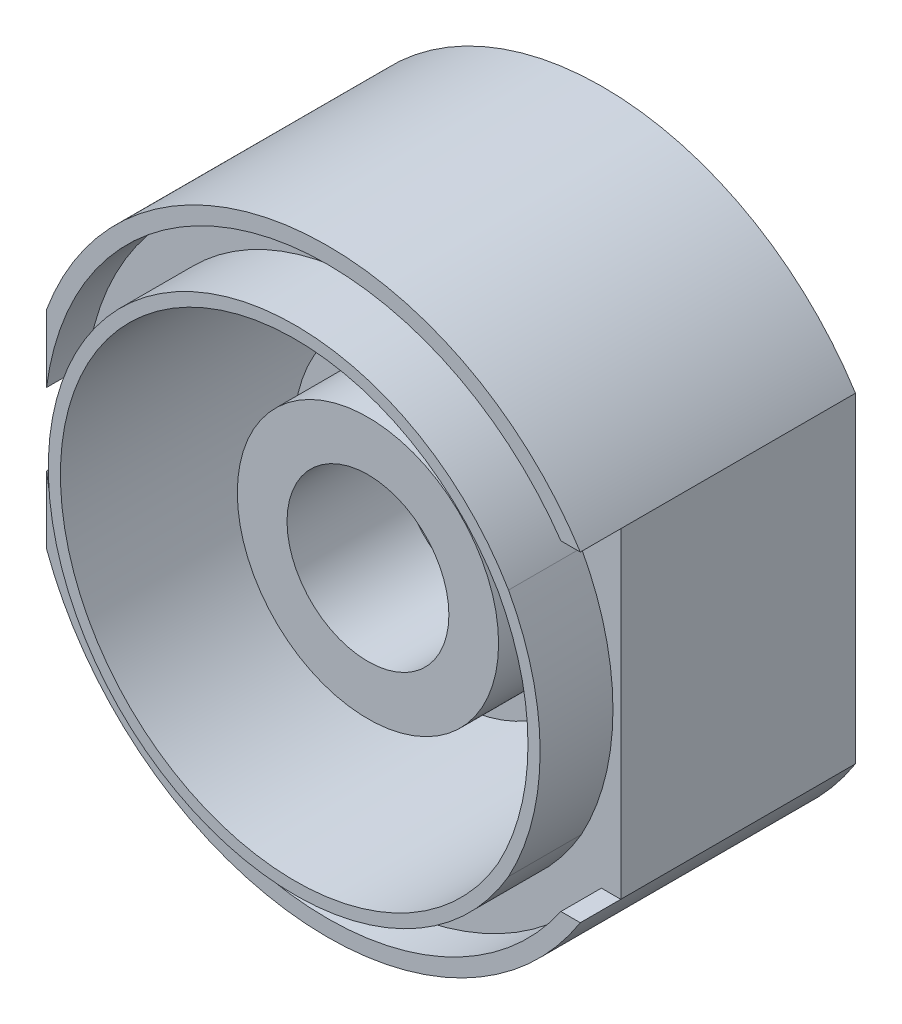
ISO-10303-21;
HEADER;
FILE_DESCRIPTION(('STEP AP214'),'2;1');
FILE_NAME('part.step','',(''),(''),'','','');
FILE_SCHEMA(('AUTOMOTIVE_DESIGN { 1 0 10303 214 1 1 1 1 }'));
ENDSEC;
DATA;
#1=APPLICATION_CONTEXT('core data for automotive mechanical design processes');
#2=APPLICATION_PROTOCOL_DEFINITION('international standard','automotive_design',2000,#1);
#3=PRODUCT_CONTEXT('',#1,'mechanical');
#4=PRODUCT('Part','Part','',(#3));
#5=PRODUCT_RELATED_PRODUCT_CATEGORY('part','',(#4));
#6=PRODUCT_DEFINITION_FORMATION('','',#4);
#7=PRODUCT_DEFINITION_CONTEXT('part definition',#1,'design');
#8=PRODUCT_DEFINITION('design','',#6,#7);
#9=PRODUCT_DEFINITION_SHAPE('','',#8);
#10=(LENGTH_UNIT() NAMED_UNIT(*) SI_UNIT(.MILLI.,.METRE.));
#11=(NAMED_UNIT(*) PLANE_ANGLE_UNIT() SI_UNIT($,.RADIAN.));
#12=(NAMED_UNIT(*) SI_UNIT($,.STERADIAN.) SOLID_ANGLE_UNIT());
#13=UNCERTAINTY_MEASURE_WITH_UNIT(LENGTH_MEASURE(1.E-05),#10,'distance_accuracy_value','');
#14=(GEOMETRIC_REPRESENTATION_CONTEXT(3) GLOBAL_UNCERTAINTY_ASSIGNED_CONTEXT((#13)) GLOBAL_UNIT_ASSIGNED_CONTEXT((#10,
#11,#12)) REPRESENTATION_CONTEXT('',''));
#15=CARTESIAN_POINT('',(0.,0.,0.));
#16=DIRECTION('',(0.,0.,1.));
#17=DIRECTION('',(1.,0.,0.));
#18=AXIS2_PLACEMENT_3D('',#15,#16,#17);
#19=CARTESIAN_POINT('',(2.2573687458903,0.,17.));
#20=DIRECTION('',(0.,0.,-1.));
#21=DIRECTION('',(-1.,0.,0.));
#22=AXIS2_PLACEMENT_3D('',#19,#20,#21);
#23=CYLINDRICAL_SURFACE('',#22,18.5);
#24=DIRECTION('',(0.,0.,-1.));
#25=VECTOR('',#24,1.);
#26=CARTESIAN_POINT('',(-15.1000822737096,6.40069481401747,17.));
#27=LINE('',#26,#25);
#28=CARTESIAN_POINT('',(-15.1000822737096,6.40069481401747,17.));
#29=VERTEX_POINT('',#28);
#30=CARTESIAN_POINT('',(-15.1000822737096,6.40069481401747,0.));
#31=VERTEX_POINT('',#30);
#32=EDGE_CURVE('E160',#29,#31,#27,.T.);
#33=ORIENTED_EDGE('',*,*,#32,.F.);
#34=CARTESIAN_POINT('',(2.2573687458903,0.,17.));
#35=DIRECTION('',(0.,0.,1.));
#36=DIRECTION('',(1.,0.,0.));
#37=AXIS2_PLACEMENT_3D('',#34,#35,#36);
#38=CIRCLE('',#37,18.5);
#39=CARTESIAN_POINT('',(17.8758661637607,9.91526794433595,17.));
#40=VERTEX_POINT('',#39);
#41=EDGE_CURVE('E189',#40,#29,#38,.T.);
#42=ORIENTED_EDGE('',*,*,#41,.F.);
#43=DIRECTION('',(0.,0.,-1.));
#44=VECTOR('',#43,1.);
#45=CARTESIAN_POINT('',(17.8758661637607,9.91526794433595,17.));
#46=LINE('',#45,#44);
#47=CARTESIAN_POINT('',(17.8758661637607,9.91526794433595,14.5));
#48=VERTEX_POINT('',#47);
#49=EDGE_CURVE('E192',#40,#48,#46,.T.);
#50=ORIENTED_EDGE('',*,*,#49,.T.);
#51=CARTESIAN_POINT('',(17.8758661637607,9.91526794433595,0.));
#52=VERTEX_POINT('',#51);
#53=EDGE_CURVE('E196',#48,#52,#46,.T.);
#54=ORIENTED_EDGE('',*,*,#53,.T.);
#55=CARTESIAN_POINT('',(2.2573687458903,0.,0.));
#56=DIRECTION('',(0.,0.,1.));
#57=DIRECTION('',(1.,0.,0.));
#58=AXIS2_PLACEMENT_3D('',#55,#56,#57);
#59=CIRCLE('',#58,18.5);
#60=EDGE_CURVE('E181',#52,#31,#59,.T.);
#61=ORIENTED_EDGE('',*,*,#60,.T.);
#62=EDGE_LOOP('',(#33,#42,#50,#54,#61));
#63=FACE_BOUND('',#62,.T.);
#64=ADVANCED_FACE('F61',(#63),#23,.T.);
#65=DIRECTION('',(0.,0.,-1.));
#66=VECTOR('',#65,1.);
#67=CARTESIAN_POINT('',(-15.1000822737096,-6.40069481401748,17.));
#68=LINE('',#67,#66);
#69=CARTESIAN_POINT('',(-15.1000822737096,-6.40069481401748,0.));
#70=VERTEX_POINT('',#69);
#71=CARTESIAN_POINT('',(-15.1000822737096,-6.40069481401748,17.));
#72=VERTEX_POINT('',#71);
#73=EDGE_CURVE('E157',#70,#72,#68,.F.);
#74=ORIENTED_EDGE('',*,*,#73,.F.);
#75=CARTESIAN_POINT('',(17.8758661637607,-9.91526794433595,0.));
#76=VERTEX_POINT('',#75);
#77=EDGE_CURVE('E171',#70,#76,#59,.T.);
#78=ORIENTED_EDGE('',*,*,#77,.T.);
#79=DIRECTION('',(0.,0.,-1.));
#80=VECTOR('',#79,1.);
#81=CARTESIAN_POINT('',(17.8758661637607,-9.91526794433595,17.));
#82=LINE('',#81,#80);
#83=CARTESIAN_POINT('',(17.8758661637607,-9.91526794433595,14.5));
#84=VERTEX_POINT('',#83);
#85=EDGE_CURVE('E195',#84,#76,#82,.T.);
#86=ORIENTED_EDGE('',*,*,#85,.F.);
#87=CARTESIAN_POINT('',(17.8758661637607,-9.91526794433595,17.));
#88=VERTEX_POINT('',#87);
#89=EDGE_CURVE('E68',#88,#84,#82,.T.);
#90=ORIENTED_EDGE('',*,*,#89,.F.);
#91=EDGE_CURVE('E174',#72,#88,#38,.T.);
#92=ORIENTED_EDGE('',*,*,#91,.F.);
#93=EDGE_LOOP('',(#74,#78,#86,#90,#92));
#94=FACE_BOUND('',#93,.T.);
#95=ADVANCED_FACE('F169',(#94),#23,.T.);
#96=CARTESIAN_POINT('',(2.2573687458903,0.,17.));
#97=DIRECTION('',(0.,0.,1.));
#98=DIRECTION('',(1.,0.,0.));
#99=AXIS2_PLACEMENT_3D('',#96,#97,#98);
#100=PLANE('',#99);
#101=ORIENTED_EDGE('',*,*,#41,.T.);
#102=DIRECTION('',(0.,-1.,0.));
#103=VECTOR('',#102,1.);
#104=CARTESIAN_POINT('',(-15.1000822737096,0.,17.));
#105=LINE('',#104,#103);
#106=CARTESIAN_POINT('',(-15.1000822737096,2.22910163567981,17.));
#107=VERTEX_POINT('',#106);
#108=EDGE_CURVE('E175',#29,#107,#105,.T.);
#109=ORIENTED_EDGE('',*,*,#108,.T.);
#110=CARTESIAN_POINT('',(2.2573687458903,0.,17.));
#111=DIRECTION('',(0.,0.,1.));
#112=DIRECTION('',(1.,0.,0.));
#113=AXIS2_PLACEMENT_3D('',#110,#111,#112);
#114=CIRCLE('',#113,17.5);
#115=CARTESIAN_POINT('',(16.6774055555529,9.91526794433595,17.));
#116=VERTEX_POINT('',#115);
#117=EDGE_CURVE('E279',#116,#107,#114,.T.);
#118=ORIENTED_EDGE('',*,*,#117,.F.);
#119=DIRECTION('',(1.,0.,0.));
#120=VECTOR('',#119,1.);
#121=CARTESIAN_POINT('',(15.3758661637607,9.91526794433595,17.));
#122=LINE('',#121,#120);
#123=EDGE_CURVE('E264',#116,#40,#122,.T.);
#124=ORIENTED_EDGE('',*,*,#123,.T.);
#125=EDGE_LOOP('',(#101,#109,#118,#124));
#126=FACE_BOUND('',#125,.T.);
#127=ADVANCED_FACE('F313',(#126),#100,.T.);
#128=CARTESIAN_POINT('',(-15.1000822737096,-2.22910163567981,17.));
#129=VERTEX_POINT('',#128);
#130=CARTESIAN_POINT('',(16.6774055555529,-9.91526794433595,17.));
#131=VERTEX_POINT('',#130);
#132=EDGE_CURVE('E278',#129,#131,#114,.T.);
#133=ORIENTED_EDGE('',*,*,#132,.F.);
#134=EDGE_CURVE('E295',#129,#72,#105,.T.);
#135=ORIENTED_EDGE('',*,*,#134,.T.);
#136=ORIENTED_EDGE('',*,*,#91,.T.);
#137=DIRECTION('',(1.,0.,0.));
#138=VECTOR('',#137,1.);
#139=CARTESIAN_POINT('',(15.3758661637607,-9.91526794433595,17.));
#140=LINE('',#139,#138);
#141=EDGE_CURVE('E263',#131,#88,#140,.T.);
#142=ORIENTED_EDGE('',*,*,#141,.F.);
#143=EDGE_LOOP('',(#133,#135,#136,#142));
#144=FACE_BOUND('',#143,.T.);
#145=ADVANCED_FACE('F294',(#144),#100,.T.);
#146=CARTESIAN_POINT('',(2.2573687458903,0.,0.));
#147=DIRECTION('',(0.,0.,1.));
#148=DIRECTION('',(1.,0.,0.));
#149=AXIS2_PLACEMENT_3D('',#146,#147,#148);
#150=PLANE('',#149);
#151=CARTESIAN_POINT('',(2.2573687458903,0.,0.));
#152=DIRECTION('',(0.,0.,-1.));
#153=DIRECTION('',(-1.,0.,0.));
#154=AXIS2_PLACEMENT_3D('',#151,#152,#153);
#155=CIRCLE('',#154,8.5);
#156=CARTESIAN_POINT('',(-6.2426312541097,0.,0.));
#157=VERTEX_POINT('',#156);
#158=EDGE_CURVE('E202',#157,#157,#155,.T.);
#159=ORIENTED_EDGE('',*,*,#158,.F.);
#160=EDGE_LOOP('',(#159));
#161=FACE_BOUND('',#160,.T.);
#162=DIRECTION('',(0.,1.,0.));
#163=VECTOR('',#162,1.);
#164=CARTESIAN_POINT('',(-15.1000822737096,8.10819314705162,0.));
#165=LINE('',#164,#163);
#166=EDGE_CURVE('E154',#70,#31,#165,.T.);
#167=ORIENTED_EDGE('',*,*,#166,.T.);
#168=ORIENTED_EDGE('',*,*,#60,.F.);
#169=DIRECTION('',(0.,1.,0.));
#170=VECTOR('',#169,1.);
#171=CARTESIAN_POINT('',(17.8758661637607,9.91526794433595,0.));
#172=LINE('',#171,#170);
#173=EDGE_CURVE('E180',#76,#52,#172,.T.);
#174=ORIENTED_EDGE('',*,*,#173,.F.);
#175=ORIENTED_EDGE('',*,*,#77,.F.);
#176=EDGE_LOOP('',(#167,#168,#174,#175));
#177=FACE_BOUND('',#176,.T.);
#178=ADVANCED_FACE('F178',(#161,#177),#150,.F.);
#179=CARTESIAN_POINT('',(2.2573687458903,0.,14.5));
#180=DIRECTION('',(0.,0.,1.));
#181=DIRECTION('',(1.,0.,0.));
#182=AXIS2_PLACEMENT_3D('',#179,#180,#181);
#183=CYLINDRICAL_SURFACE('',#182,17.5);
#184=DIRECTION('',(0.,0.,1.));
#185=VECTOR('',#184,1.);
#186=CARTESIAN_POINT('',(-15.1000822737096,-2.22910163567981,14.5));
#187=LINE('',#186,#185);
#188=CARTESIAN_POINT('',(-15.1000822737096,-2.22910163567981,14.5));
#189=VERTEX_POINT('',#188);
#190=EDGE_CURVE('E75',#129,#189,#187,.F.);
#191=ORIENTED_EDGE('',*,*,#190,.F.);
#192=ORIENTED_EDGE('',*,*,#132,.T.);
#193=DIRECTION('',(0.,0.,1.));
#194=VECTOR('',#193,1.);
#195=CARTESIAN_POINT('',(16.6774055555529,-9.91526794433595,14.5));
#196=LINE('',#195,#194);
#197=CARTESIAN_POINT('',(16.6774055555529,-9.91526794433595,14.5));
#198=VERTEX_POINT('',#197);
#199=EDGE_CURVE('E267',#131,#198,#196,.F.);
#200=ORIENTED_EDGE('',*,*,#199,.T.);
#201=CARTESIAN_POINT('',(2.2573687458903,0.,14.5));
#202=DIRECTION('',(0.,0.,1.));
#203=DIRECTION('',(1.,0.,0.));
#204=AXIS2_PLACEMENT_3D('',#201,#202,#203);
#205=CIRCLE('',#204,17.5);
#206=EDGE_CURVE('E185',#189,#198,#205,.T.);
#207=ORIENTED_EDGE('',*,*,#206,.F.);
#208=EDGE_LOOP('',(#191,#192,#200,#207));
#209=FACE_BOUND('',#208,.T.);
#210=ADVANCED_FACE('F287',(#209),#183,.F.);
#211=DIRECTION('',(0.,0.,1.));
#212=VECTOR('',#211,1.);
#213=CARTESIAN_POINT('',(-15.1000822737096,2.22910163567981,14.5));
#214=LINE('',#213,#212);
#215=CARTESIAN_POINT('',(-15.1000822737096,2.22910163567981,14.5));
#216=VERTEX_POINT('',#215);
#217=EDGE_CURVE('E165',#216,#107,#214,.T.);
#218=ORIENTED_EDGE('',*,*,#217,.F.);
#219=CARTESIAN_POINT('',(16.6774055555529,9.91526794433595,14.5));
#220=VERTEX_POINT('',#219);
#221=EDGE_CURVE('E182',#220,#216,#205,.T.);
#222=ORIENTED_EDGE('',*,*,#221,.F.);
#223=DIRECTION('',(0.,0.,1.));
#224=VECTOR('',#223,1.);
#225=CARTESIAN_POINT('',(16.6774055555529,9.91526794433595,14.5));
#226=LINE('',#225,#224);
#227=EDGE_CURVE('E276',#220,#116,#226,.T.);
#228=ORIENTED_EDGE('',*,*,#227,.T.);
#229=ORIENTED_EDGE('',*,*,#117,.T.);
#230=EDGE_LOOP('',(#218,#222,#228,#229));
#231=FACE_BOUND('',#230,.T.);
#232=ADVANCED_FACE('F309',(#231),#183,.F.);
#233=CARTESIAN_POINT('',(2.2573687458903,0.,14.5));
#234=DIRECTION('',(0.,0.,1.));
#235=DIRECTION('',(1.,0.,0.));
#236=AXIS2_PLACEMENT_3D('',#233,#234,#235);
#237=PLANE('',#236);
#238=CARTESIAN_POINT('',(1.37584539113167,0.,14.5));
#239=DIRECTION('',(0.,0.,1.));
#240=DIRECTION('',(-1.,0.,0.));
#241=AXIS2_PLACEMENT_3D('',#238,#239,#240);
#242=CIRCLE('',#241,16.0182024487757);
#243=CARTESIAN_POINT('',(15.4409254489024,-7.66526794433594,14.5));
#244=VERTEX_POINT('',#243);
#245=CARTESIAN_POINT('',(15.4409254489024,7.66526794433595,14.5));
#246=VERTEX_POINT('',#245);
#247=EDGE_CURVE('E252',#244,#246,#242,.T.);
#248=ORIENTED_EDGE('',*,*,#247,.F.);
#249=CARTESIAN_POINT('',(2.2573687458903,0.,14.5));
#250=DIRECTION('',(0.,0.,1.));
#251=DIRECTION('',(1.,0.,0.));
#252=AXIS2_PLACEMENT_3D('',#249,#250,#251);
#253=CIRCLE('',#252,15.25);
#254=EDGE_CURVE('E82',#246,#244,#253,.T.);
#255=ORIENTED_EDGE('',*,*,#254,.F.);
#256=EDGE_LOOP('',(#248,#255));
#257=FACE_BOUND('',#256,.T.);
#258=ORIENTED_EDGE('',*,*,#221,.T.);
#259=DIRECTION('',(0.,-1.,0.));
#260=VECTOR('',#259,1.);
#261=CARTESIAN_POINT('',(-15.1000822737096,0.,14.5));
#262=LINE('',#261,#260);
#263=EDGE_CURVE('E12',#216,#189,#262,.T.);
#264=ORIENTED_EDGE('',*,*,#263,.T.);
#265=ORIENTED_EDGE('',*,*,#206,.T.);
#266=DIRECTION('',(1.,0.,0.));
#267=VECTOR('',#266,1.);
#268=CARTESIAN_POINT('',(15.3758661637607,-9.91526794433595,14.5));
#269=LINE('',#268,#267);
#270=EDGE_CURVE('E270',#198,#84,#269,.T.);
#271=ORIENTED_EDGE('',*,*,#270,.T.);
#272=DIRECTION('',(0.,1.,0.));
#273=VECTOR('',#272,1.);
#274=CARTESIAN_POINT('',(17.8758661637607,9.91526794433595,14.5));
#275=LINE('',#274,#273);
#276=EDGE_CURVE('E260',#84,#48,#275,.T.);
#277=ORIENTED_EDGE('',*,*,#276,.T.);
#278=DIRECTION('',(1.,0.,0.));
#279=VECTOR('',#278,1.);
#280=CARTESIAN_POINT('',(15.3758661637607,9.91526794433595,14.5));
#281=LINE('',#280,#279);
#282=EDGE_CURVE('E268',#220,#48,#281,.T.);
#283=ORIENTED_EDGE('',*,*,#282,.F.);
#284=EDGE_LOOP('',(#258,#264,#265,#271,#277,#283));
#285=FACE_BOUND('',#284,.T.);
#286=ADVANCED_FACE('F307',(#257,#285),#237,.T.);
#287=CARTESIAN_POINT('',(2.2573687458903,0.,14.5));
#288=DIRECTION('',(0.,0.,1.));
#289=DIRECTION('',(1.,0.,0.));
#290=AXIS2_PLACEMENT_3D('',#287,#288,#289);
#291=CIRCLE('',#290,5.);
#292=CARTESIAN_POINT('',(7.2573687458903,0.,14.5));
#293=VERTEX_POINT('',#292);
#294=EDGE_CURVE('E199',#293,#293,#291,.T.);
#295=ORIENTED_EDGE('',*,*,#294,.F.);
#296=EDGE_LOOP('',(#295));
#297=FACE_BOUND('',#296,.T.);
#298=CARTESIAN_POINT('',(2.2573687458903,0.,14.5));
#299=DIRECTION('',(0.,0.,1.));
#300=DIRECTION('',(1.,0.,0.));
#301=AXIS2_PLACEMENT_3D('',#298,#299,#300);
#302=CIRCLE('',#301,8.07115888196787);
#303=CARTESIAN_POINT('',(10.3285276278582,0.,14.5));
#304=VERTEX_POINT('',#303);
#305=EDGE_CURVE('E219',#304,#304,#302,.T.);
#306=ORIENTED_EDGE('',*,*,#305,.T.);
#307=EDGE_LOOP('',(#306));
#308=FACE_BOUND('',#307,.T.);
#309=ADVANCED_FACE('F458',(#297,#308),#237,.T.);
#310=CARTESIAN_POINT('',(2.2573687458903,0.,2.));
#311=DIRECTION('',(0.,0.,1.));
#312=DIRECTION('',(1.,0.,0.));
#313=AXIS2_PLACEMENT_3D('',#310,#311,#312);
#314=CYLINDRICAL_SURFACE('',#313,9.57115888196787);
#315=CARTESIAN_POINT('',(2.2573687458903,0.,2.));
#316=DIRECTION('',(0.,0.,1.));
#317=DIRECTION('',(1.,0.,0.));
#318=AXIS2_PLACEMENT_3D('',#315,#316,#317);
#319=CIRCLE('',#318,9.57115888196787);
#320=CARTESIAN_POINT('',(11.8285276278582,0.,2.));
#321=VERTEX_POINT('',#320);
#322=EDGE_CURVE('E211',#321,#321,#319,.T.);
#323=ORIENTED_EDGE('',*,*,#322,.T.);
#324=EDGE_LOOP('',(#323));
#325=FACE_BOUND('',#324,.T.);
#326=CARTESIAN_POINT('',(2.2573687458903,0.,9.5));
#327=DIRECTION('',(0.,0.,1.));
#328=DIRECTION('',(1.,0.,0.));
#329=AXIS2_PLACEMENT_3D('',#326,#327,#328);
#330=CIRCLE('',#329,9.57115888196787);
#331=CARTESIAN_POINT('',(11.8285276278582,0.,9.5));
#332=VERTEX_POINT('',#331);
#333=EDGE_CURVE('E209',#332,#332,#330,.F.);
#334=ORIENTED_EDGE('',*,*,#333,.T.);
#335=EDGE_LOOP('',(#334));
#336=FACE_BOUND('',#335,.T.);
#337=ADVANCED_FACE('F426',(#325,#336),#314,.T.);
#338=CARTESIAN_POINT('',(2.2573687458903,0.,34.));
#339=DIRECTION('',(0.,0.,-1.));
#340=DIRECTION('',(-1.,0.,0.));
#341=AXIS2_PLACEMENT_3D('',#338,#339,#340);
#342=CYLINDRICAL_SURFACE('',#341,5.);
#343=ORIENTED_EDGE('',*,*,#294,.T.);
#344=EDGE_LOOP('',(#343));
#345=FACE_BOUND('',#344,.T.);
#346=CARTESIAN_POINT('',(2.2573687458903,0.,7.5));
#347=DIRECTION('',(0.,0.,-1.));
#348=DIRECTION('',(-1.,0.,0.));
#349=AXIS2_PLACEMENT_3D('',#346,#347,#348);
#350=CIRCLE('',#349,5.);
#351=CARTESIAN_POINT('',(-2.7426312541097,0.,7.5));
#352=VERTEX_POINT('',#351);
#353=EDGE_CURVE('E204',#352,#352,#350,.F.);
#354=ORIENTED_EDGE('',*,*,#353,.F.);
#355=EDGE_LOOP('',(#354));
#356=FACE_BOUND('',#355,.T.);
#357=ADVANCED_FACE('F324',(#345,#356),#342,.F.);
#358=CARTESIAN_POINT('',(17.8758661637607,9.91526794433595,17.));
#359=DIRECTION('',(-1.,0.,0.));
#360=DIRECTION('',(0.,0.,1.));
#361=AXIS2_PLACEMENT_3D('',#358,#359,#360);
#362=PLANE('',#361);
#363=ORIENTED_EDGE('',*,*,#53,.F.);
#364=ORIENTED_EDGE('',*,*,#276,.F.);
#365=ORIENTED_EDGE('',*,*,#85,.T.);
#366=ORIENTED_EDGE('',*,*,#173,.T.);
#367=EDGE_LOOP('',(#363,#364,#365,#366));
#368=FACE_BOUND('',#367,.T.);
#369=ADVANCED_FACE('F304',(#368),#362,.F.);
#370=CARTESIAN_POINT('',(15.3758661637607,9.91526794433595,17.));
#371=DIRECTION('',(0.,1.,0.));
#372=DIRECTION('',(0.,0.,1.));
#373=AXIS2_PLACEMENT_3D('',#370,#371,#372);
#374=PLANE('',#373);
#375=ORIENTED_EDGE('',*,*,#282,.T.);
#376=ORIENTED_EDGE('',*,*,#49,.F.);
#377=ORIENTED_EDGE('',*,*,#123,.F.);
#378=ORIENTED_EDGE('',*,*,#227,.F.);
#379=EDGE_LOOP('',(#375,#376,#377,#378));
#380=FACE_BOUND('',#379,.T.);
#381=ADVANCED_FACE('F315',(#380),#374,.F.);
#382=CARTESIAN_POINT('',(15.3758661637607,-9.91526794433595,14.5));
#383=DIRECTION('',(0.,-1.,0.));
#384=DIRECTION('',(0.,0.,-1.));
#385=AXIS2_PLACEMENT_3D('',#382,#383,#384);
#386=PLANE('',#385);
#387=ORIENTED_EDGE('',*,*,#141,.T.);
#388=ORIENTED_EDGE('',*,*,#89,.T.);
#389=ORIENTED_EDGE('',*,*,#270,.F.);
#390=ORIENTED_EDGE('',*,*,#199,.F.);
#391=EDGE_LOOP('',(#387,#388,#389,#390));
#392=FACE_BOUND('',#391,.T.);
#393=ADVANCED_FACE('F293',(#392),#386,.F.);
#394=CARTESIAN_POINT('',(1.81660706851099,0.,19.));
#395=DIRECTION('',(0.,0.,1.));
#396=DIRECTION('',(1.,0.,0.));
#397=AXIS2_PLACEMENT_3D('',#394,#395,#396);
#398=PLANE('',#397);
#399=CARTESIAN_POINT('',(2.2573687458903,0.,19.));
#400=DIRECTION('',(0.,0.,1.));
#401=DIRECTION('',(1.,0.,0.));
#402=AXIS2_PLACEMENT_3D('',#399,#400,#401);
#403=CIRCLE('',#402,15.25);
#404=CARTESIAN_POINT('',(15.4409254489024,7.66526794433595,19.));
#405=VERTEX_POINT('',#404);
#406=CARTESIAN_POINT('',(15.4409254489024,-7.66526794433594,19.));
#407=VERTEX_POINT('',#406);
#408=EDGE_CURVE('E248',#405,#407,#403,.T.);
#409=ORIENTED_EDGE('',*,*,#408,.T.);
#410=CARTESIAN_POINT('',(1.37584539113167,0.,19.));
#411=DIRECTION('',(0.,0.,1.));
#412=DIRECTION('',(-1.,0.,0.));
#413=AXIS2_PLACEMENT_3D('',#410,#411,#412);
#414=CIRCLE('',#413,16.0182024487757);
#415=EDGE_CURVE('E251',#407,#405,#414,.T.);
#416=ORIENTED_EDGE('',*,*,#415,.T.);
#417=EDGE_LOOP('',(#409,#416));
#418=FACE_BOUND('',#417,.T.);
#419=CARTESIAN_POINT('',(1.37584539113167,0.,19.));
#420=DIRECTION('',(0.,0.,1.));
#421=DIRECTION('',(1.,0.,0.));
#422=AXIS2_PLACEMENT_3D('',#419,#420,#421);
#423=CIRCLE('',#422,15.2682024487757);
#424=CARTESIAN_POINT('',(14.7873388666847,-7.297249397684,19.));
#425=VERTEX_POINT('',#424);
#426=CARTESIAN_POINT('',(14.7873388666847,7.29724939768395,19.));
#427=VERTEX_POINT('',#426);
#428=EDGE_CURVE('E242',#425,#427,#423,.T.);
#429=ORIENTED_EDGE('',*,*,#428,.F.);
#430=CARTESIAN_POINT('',(2.2573687458903,0.,19.));
#431=DIRECTION('',(0.,0.,1.));
#432=DIRECTION('',(1.,0.,0.));
#433=AXIS2_PLACEMENT_3D('',#430,#431,#432);
#434=CIRCLE('',#433,14.5);
#435=EDGE_CURVE('E237',#427,#425,#434,.T.);
#436=ORIENTED_EDGE('',*,*,#435,.F.);
#437=EDGE_LOOP('',(#429,#436));
#438=FACE_BOUND('',#437,.T.);
#439=ADVANCED_FACE('F322',(#418,#438),#398,.T.);
#440=CARTESIAN_POINT('',(2.2573687458903,0.,19.));
#441=DIRECTION('',(0.,0.,-1.));
#442=DIRECTION('',(-1.,0.,0.));
#443=AXIS2_PLACEMENT_3D('',#440,#441,#442);
#444=CYLINDRICAL_SURFACE('',#443,15.25);
#445=ORIENTED_EDGE('',*,*,#254,.T.);
#446=DIRECTION('',(0.,0.,-1.));
#447=VECTOR('',#446,1.);
#448=CARTESIAN_POINT('',(15.4409254489024,-7.66526794433594,19.));
#449=LINE('',#448,#447);
#450=EDGE_CURVE('E258',#407,#244,#449,.T.);
#451=ORIENTED_EDGE('',*,*,#450,.F.);
#452=ORIENTED_EDGE('',*,*,#408,.F.);
#453=DIRECTION('',(0.,0.,-1.));
#454=VECTOR('',#453,1.);
#455=CARTESIAN_POINT('',(15.4409254489024,7.66526794433595,19.));
#456=LINE('',#455,#454);
#457=EDGE_CURVE('E254',#405,#246,#456,.T.);
#458=ORIENTED_EDGE('',*,*,#457,.T.);
#459=EDGE_LOOP('',(#445,#451,#452,#458));
#460=FACE_BOUND('',#459,.T.);
#461=ADVANCED_FACE('F375',(#460),#444,.T.);
#462=CARTESIAN_POINT('',(1.37584539113167,0.,19.));
#463=DIRECTION('',(0.,0.,-1.));
#464=DIRECTION('',(-1.,0.,0.));
#465=AXIS2_PLACEMENT_3D('',#462,#463,#464);
#466=CYLINDRICAL_SURFACE('',#465,16.0182024487757);
#467=ORIENTED_EDGE('',*,*,#247,.T.);
#468=ORIENTED_EDGE('',*,*,#457,.F.);
#469=ORIENTED_EDGE('',*,*,#415,.F.);
#470=ORIENTED_EDGE('',*,*,#450,.T.);
#471=EDGE_LOOP('',(#467,#468,#469,#470));
#472=FACE_BOUND('',#471,.T.);
#473=ADVANCED_FACE('F371',(#472),#466,.T.);
#474=CARTESIAN_POINT('',(2.2573687458903,0.,19.));
#475=DIRECTION('',(0.,0.,-1.));
#476=DIRECTION('',(-1.,0.,0.));
#477=AXIS2_PLACEMENT_3D('',#474,#475,#476);
#478=CYLINDRICAL_SURFACE('',#477,14.5);
#479=DIRECTION('',(0.,0.,-1.));
#480=VECTOR('',#479,1.);
#481=CARTESIAN_POINT('',(14.7873388666847,-7.297249397684,19.));
#482=LINE('',#481,#480);
#483=CARTESIAN_POINT('',(14.7873388666847,-7.297249397684,2.));
#484=VERTEX_POINT('',#483);
#485=EDGE_CURVE('E246',#425,#484,#482,.T.);
#486=ORIENTED_EDGE('',*,*,#485,.T.);
#487=CARTESIAN_POINT('',(2.2573687458903,0.,2.));
#488=DIRECTION('',(0.,0.,1.));
#489=DIRECTION('',(1.,0.,0.));
#490=AXIS2_PLACEMENT_3D('',#487,#488,#489);
#491=CIRCLE('',#490,14.5);
#492=CARTESIAN_POINT('',(14.7873388666847,7.29724939768395,2.));
#493=VERTEX_POINT('',#492);
#494=EDGE_CURVE('E229',#493,#484,#491,.T.);
#495=ORIENTED_EDGE('',*,*,#494,.F.);
#496=DIRECTION('',(0.,0.,-1.));
#497=VECTOR('',#496,1.);
#498=CARTESIAN_POINT('',(14.7873388666847,7.29724939768395,19.));
#499=LINE('',#498,#497);
#500=EDGE_CURVE('E244',#427,#493,#499,.T.);
#501=ORIENTED_EDGE('',*,*,#500,.F.);
#502=ORIENTED_EDGE('',*,*,#435,.T.);
#503=EDGE_LOOP('',(#486,#495,#501,#502));
#504=FACE_BOUND('',#503,.T.);
#505=ADVANCED_FACE('F363',(#504),#478,.F.);
#506=CARTESIAN_POINT('',(1.37584539113167,0.,19.));
#507=DIRECTION('',(0.,0.,-1.));
#508=DIRECTION('',(-1.,0.,0.));
#509=AXIS2_PLACEMENT_3D('',#506,#507,#508);
#510=CYLINDRICAL_SURFACE('',#509,15.2682024487757);
#511=ORIENTED_EDGE('',*,*,#500,.T.);
#512=CARTESIAN_POINT('',(1.37584539113167,0.,2.));
#513=DIRECTION('',(0.,0.,1.));
#514=DIRECTION('',(1.,0.,0.));
#515=AXIS2_PLACEMENT_3D('',#512,#513,#514);
#516=CIRCLE('',#515,15.2682024487757);
#517=EDGE_CURVE('E216',#484,#493,#516,.T.);
#518=ORIENTED_EDGE('',*,*,#517,.F.);
#519=ORIENTED_EDGE('',*,*,#485,.F.);
#520=ORIENTED_EDGE('',*,*,#428,.T.);
#521=EDGE_LOOP('',(#511,#518,#519,#520));
#522=FACE_BOUND('',#521,.T.);
#523=ADVANCED_FACE('F351',(#522),#510,.F.);
#524=CARTESIAN_POINT('',(2.2573687458903,0.,6.5));
#525=DIRECTION('',(0.,0.,-1.));
#526=DIRECTION('',(-1.,0.,0.));
#527=AXIS2_PLACEMENT_3D('',#524,#525,#526);
#528=CYLINDRICAL_SURFACE('',#527,8.5);
#529=CARTESIAN_POINT('',(2.2573687458903,0.,6.5));
#530=DIRECTION('',(0.,0.,-1.));
#531=DIRECTION('',(-1.,0.,0.));
#532=AXIS2_PLACEMENT_3D('',#529,#530,#531);
#533=CIRCLE('',#532,8.5);
#534=CARTESIAN_POINT('',(-6.2426312541097,0.,6.5));
#535=VERTEX_POINT('',#534);
#536=EDGE_CURVE('E234',#535,#535,#533,.T.);
#537=ORIENTED_EDGE('',*,*,#536,.F.);
#538=EDGE_LOOP('',(#537));
#539=FACE_BOUND('',#538,.T.);
#540=ORIENTED_EDGE('',*,*,#158,.T.);
#541=EDGE_LOOP('',(#540));
#542=FACE_BOUND('',#541,.T.);
#543=ADVANCED_FACE('F348',(#539,#542),#528,.F.);
#544=CARTESIAN_POINT('',(2.2573687458903,0.,6.5));
#545=DIRECTION('',(0.,0.,-1.));
#546=DIRECTION('',(-1.,0.,0.));
#547=AXIS2_PLACEMENT_3D('',#544,#545,#546);
#548=PLANE('',#547);
#549=CARTESIAN_POINT('',(2.2573687458903,0.,6.5));
#550=DIRECTION('',(0.,0.,-1.));
#551=DIRECTION('',(-1.,0.,0.));
#552=AXIS2_PLACEMENT_3D('',#549,#550,#551);
#553=CIRCLE('',#552,6.);
#554=CARTESIAN_POINT('',(-3.7426312541097,0.,6.5));
#555=VERTEX_POINT('',#554);
#556=EDGE_CURVE('E203',#555,#555,#553,.T.);
#557=ORIENTED_EDGE('',*,*,#556,.F.);
#558=EDGE_LOOP('',(#557));
#559=FACE_BOUND('',#558,.T.);
#560=ORIENTED_EDGE('',*,*,#536,.T.);
#561=EDGE_LOOP('',(#560));
#562=FACE_BOUND('',#561,.T.);
#563=ADVANCED_FACE('F350',(#559,#562),#548,.T.);
#564=CARTESIAN_POINT('',(2.2573687458903,0.,7.5));
#565=DIRECTION('',(0.,0.,-1.));
#566=DIRECTION('',(-1.,0.,0.));
#567=AXIS2_PLACEMENT_3D('',#564,#565,#566);
#568=PLANE('',#567);
#569=CARTESIAN_POINT('',(2.2573687458903,0.,7.5));
#570=DIRECTION('',(0.,0.,-1.));
#571=DIRECTION('',(-1.,0.,0.));
#572=AXIS2_PLACEMENT_3D('',#569,#570,#571);
#573=CIRCLE('',#572,6.);
#574=CARTESIAN_POINT('',(-3.7426312541097,0.,7.5));
#575=VERTEX_POINT('',#574);
#576=EDGE_CURVE('E207',#575,#575,#573,.T.);
#577=ORIENTED_EDGE('',*,*,#576,.T.);
#578=EDGE_LOOP('',(#577));
#579=FACE_BOUND('',#578,.T.);
#580=ORIENTED_EDGE('',*,*,#353,.T.);
#581=EDGE_LOOP('',(#580));
#582=FACE_BOUND('',#581,.T.);
#583=ADVANCED_FACE('F359',(#579,#582),#568,.T.);
#584=CARTESIAN_POINT('',(2.2573687458903,0.,7.5));
#585=DIRECTION('',(0.,0.,-1.));
#586=DIRECTION('',(-1.,0.,0.));
#587=AXIS2_PLACEMENT_3D('',#584,#585,#586);
#588=CYLINDRICAL_SURFACE('',#587,6.);
#589=ORIENTED_EDGE('',*,*,#556,.T.);
#590=EDGE_LOOP('',(#589));
#591=FACE_BOUND('',#590,.T.);
#592=ORIENTED_EDGE('',*,*,#576,.F.);
#593=EDGE_LOOP('',(#592));
#594=FACE_BOUND('',#593,.T.);
#595=ADVANCED_FACE('F432',(#591,#594),#588,.F.);
#596=CARTESIAN_POINT('',(1.81660706851099,0.,2.));
#597=DIRECTION('',(0.,0.,1.));
#598=DIRECTION('',(1.,0.,0.));
#599=AXIS2_PLACEMENT_3D('',#596,#597,#598);
#600=PLANE('',#599);
#601=ORIENTED_EDGE('',*,*,#322,.F.);
#602=EDGE_LOOP('',(#601));
#603=FACE_BOUND('',#602,.T.);
#604=ORIENTED_EDGE('',*,*,#517,.T.);
#605=ORIENTED_EDGE('',*,*,#494,.T.);
#606=EDGE_LOOP('',(#604,#605));
#607=FACE_BOUND('',#606,.T.);
#608=ADVANCED_FACE('F441',(#603,#607),#600,.T.);
#609=CARTESIAN_POINT('',(2.2573687458903,0.,9.5));
#610=DIRECTION('',(0.,0.,1.));
#611=DIRECTION('',(1.,0.,0.));
#612=AXIS2_PLACEMENT_3D('',#609,#610,#611);
#613=PLANE('',#612);
#614=ORIENTED_EDGE('',*,*,#333,.F.);
#615=EDGE_LOOP('',(#614));
#616=FACE_BOUND('',#615,.T.);
#617=CARTESIAN_POINT('',(2.2573687458903,0.,9.5));
#618=DIRECTION('',(0.,0.,1.));
#619=DIRECTION('',(1.,0.,0.));
#620=AXIS2_PLACEMENT_3D('',#617,#618,#619);
#621=CIRCLE('',#620,8.07115888196787);
#622=CARTESIAN_POINT('',(10.3285276278582,0.,9.5));
#623=VERTEX_POINT('',#622);
#624=EDGE_CURVE('E212',#623,#623,#621,.T.);
#625=ORIENTED_EDGE('',*,*,#624,.F.);
#626=EDGE_LOOP('',(#625));
#627=FACE_BOUND('',#626,.T.);
#628=ADVANCED_FACE('F452',(#616,#627),#613,.T.);
#629=CARTESIAN_POINT('',(2.2573687458903,0.,9.5));
#630=DIRECTION('',(0.,0.,1.));
#631=DIRECTION('',(1.,0.,0.));
#632=AXIS2_PLACEMENT_3D('',#629,#630,#631);
#633=CYLINDRICAL_SURFACE('',#632,8.07115888196787);
#634=ORIENTED_EDGE('',*,*,#624,.T.);
#635=EDGE_LOOP('',(#634));
#636=FACE_BOUND('',#635,.T.);
#637=ORIENTED_EDGE('',*,*,#305,.F.);
#638=EDGE_LOOP('',(#637));
#639=FACE_BOUND('',#638,.T.);
#640=ADVANCED_FACE('F474',(#636,#639),#633,.T.);
#641=CARTESIAN_POINT('',(-15.1000822737096,8.10819314705162,31.5));
#642=DIRECTION('',(-1.,0.,0.));
#643=DIRECTION('',(0.,0.,1.));
#644=AXIS2_PLACEMENT_3D('',#641,#642,#643);
#645=PLANE('',#644);
#646=ORIENTED_EDGE('',*,*,#32,.T.);
#647=ORIENTED_EDGE('',*,*,#166,.F.);
#648=ORIENTED_EDGE('',*,*,#73,.T.);
#649=ORIENTED_EDGE('',*,*,#134,.F.);
#650=ORIENTED_EDGE('',*,*,#190,.T.);
#651=ORIENTED_EDGE('',*,*,#263,.F.);
#652=ORIENTED_EDGE('',*,*,#217,.T.);
#653=ORIENTED_EDGE('',*,*,#108,.F.);
#654=EDGE_LOOP('',(#646,#647,#648,#649,#650,#651,#652,#653));
#655=FACE_BOUND('',#654,.T.);
#656=ADVANCED_FACE('F156',(#655),#645,.T.);
#657=CLOSED_SHELL('',(#64,#95,#127,#145,#178,#210,#232,#286,#309,#337,#357,#369,#381,#393,#439,
#461,#473,#505,#523,#543,#563,#583,#595,#608,#628,#640,#656));
#658=MANIFOLD_SOLID_BREP('B2',#657);
#659=ADVANCED_BREP_SHAPE_REPRESENTATION('',(#18,#658),#14);
#660=SHAPE_DEFINITION_REPRESENTATION(#9,#659);
ENDSEC;
END-ISO-10303-21;
